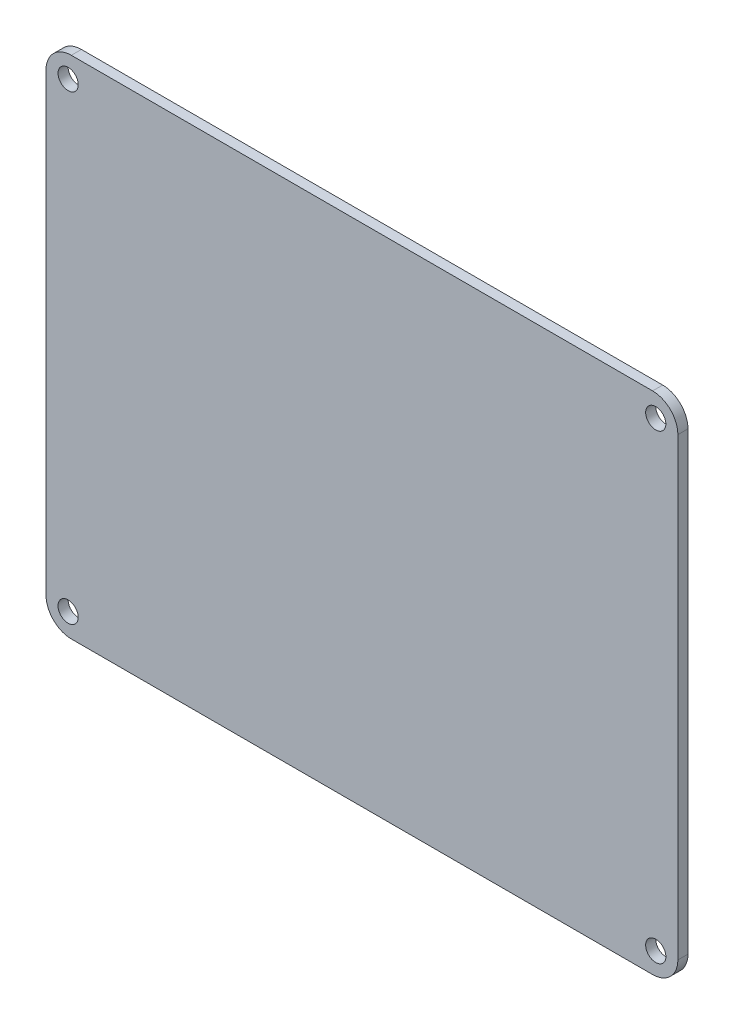
ISO-10303-21;
HEADER;
FILE_DESCRIPTION(('STEP AP214'),'2;1');
FILE_NAME('part.step','',(''),(''),'','','');
FILE_SCHEMA(('AUTOMOTIVE_DESIGN { 1 0 10303 214 1 1 1 1 }'));
ENDSEC;
DATA;
#1=APPLICATION_CONTEXT('core data for automotive mechanical design processes');
#2=APPLICATION_PROTOCOL_DEFINITION('international standard','automotive_design',2000,#1);
#3=PRODUCT_CONTEXT('',#1,'mechanical');
#4=PRODUCT('Part','Part','',(#3));
#5=PRODUCT_RELATED_PRODUCT_CATEGORY('part','',(#4));
#6=PRODUCT_DEFINITION_FORMATION('','',#4);
#7=PRODUCT_DEFINITION_CONTEXT('part definition',#1,'design');
#8=PRODUCT_DEFINITION('design','',#6,#7);
#9=PRODUCT_DEFINITION_SHAPE('','',#8);
#10=(LENGTH_UNIT() NAMED_UNIT(*) SI_UNIT(.MILLI.,.METRE.));
#11=(NAMED_UNIT(*) PLANE_ANGLE_UNIT() SI_UNIT($,.RADIAN.));
#12=(NAMED_UNIT(*) SI_UNIT($,.STERADIAN.) SOLID_ANGLE_UNIT());
#13=UNCERTAINTY_MEASURE_WITH_UNIT(LENGTH_MEASURE(1.E-05),#10,'distance_accuracy_value','');
#14=(GEOMETRIC_REPRESENTATION_CONTEXT(3) GLOBAL_UNCERTAINTY_ASSIGNED_CONTEXT((#13)) GLOBAL_UNIT_ASSIGNED_CONTEXT((#10,
#11,#12)) REPRESENTATION_CONTEXT('',''));
#15=CARTESIAN_POINT('',(0.,0.,0.));
#16=DIRECTION('',(0.,0.,1.));
#17=DIRECTION('',(1.,0.,0.));
#18=AXIS2_PLACEMENT_3D('',#15,#16,#17);
#19=CARTESIAN_POINT('',(-46.0000000000002,-35.9999999999997,1.6));
#20=DIRECTION('',(0.,0.,-1.));
#21=DIRECTION('',(-1.,0.,0.));
#22=AXIS2_PLACEMENT_3D('',#19,#20,#21);
#23=PLANE('',#22);
#24=CARTESIAN_POINT('',(-46.0000000000002,-35.9999999999997,1.6));
#25=DIRECTION('',(0.,0.,1.));
#26=DIRECTION('',(-1.,0.,0.));
#27=AXIS2_PLACEMENT_3D('',#24,#25,#26);
#28=CIRCLE('',#27,4.);
#29=CARTESIAN_POINT('',(-50.0000000000002,-35.9999999999997,1.6));
#30=VERTEX_POINT('',#29);
#31=CARTESIAN_POINT('',(-46.0000000000002,-39.9999999999997,1.6));
#32=VERTEX_POINT('',#31);
#33=EDGE_CURVE('E164',#30,#32,#28,.T.);
#34=ORIENTED_EDGE('',*,*,#33,.T.);
#35=DIRECTION('',(1.,0.,0.));
#36=VECTOR('',#35,1.);
#37=CARTESIAN_POINT('',(45.9999999999998,-39.9999999999997,1.6));
#38=LINE('',#37,#36);
#39=CARTESIAN_POINT('',(45.9999999999998,-39.9999999999997,1.6));
#40=VERTEX_POINT('',#39);
#41=EDGE_CURVE('E100',#32,#40,#38,.T.);
#42=ORIENTED_EDGE('',*,*,#41,.T.);
#43=CARTESIAN_POINT('',(45.9999999999998,-35.9999999999997,1.6));
#44=DIRECTION('',(0.,0.,1.));
#45=DIRECTION('',(1.,0.,0.));
#46=AXIS2_PLACEMENT_3D('',#43,#44,#45);
#47=CIRCLE('',#46,4.);
#48=CARTESIAN_POINT('',(49.9999999999998,-35.9999999999997,1.6));
#49=VERTEX_POINT('',#48);
#50=EDGE_CURVE('E185',#40,#49,#47,.T.);
#51=ORIENTED_EDGE('',*,*,#50,.T.);
#52=DIRECTION('',(0.,1.,0.));
#53=VECTOR('',#52,1.);
#54=CARTESIAN_POINT('',(49.9999999999998,-35.9999999999997,1.6));
#55=LINE('',#54,#53);
#56=CARTESIAN_POINT('',(49.9999999999998,36.0000000000001,1.6));
#57=VERTEX_POINT('',#56);
#58=EDGE_CURVE('E199',#49,#57,#55,.T.);
#59=ORIENTED_EDGE('',*,*,#58,.T.);
#60=CARTESIAN_POINT('',(45.9999999999998,36.0000000000001,1.6));
#61=DIRECTION('',(0.,0.,1.));
#62=DIRECTION('',(1.,0.,0.));
#63=AXIS2_PLACEMENT_3D('',#60,#61,#62);
#64=CIRCLE('',#63,4.);
#65=CARTESIAN_POINT('',(45.9999999999998,40.0000000000001,1.6));
#66=VERTEX_POINT('',#65);
#67=EDGE_CURVE('E119',#57,#66,#64,.T.);
#68=ORIENTED_EDGE('',*,*,#67,.T.);
#69=DIRECTION('',(-1.,0.,0.));
#70=VECTOR('',#69,1.);
#71=CARTESIAN_POINT('',(45.9999999999998,40.0000000000001,1.6));
#72=LINE('',#71,#70);
#73=CARTESIAN_POINT('',(-46.0000000000002,40.0000000000001,1.6));
#74=VERTEX_POINT('',#73);
#75=EDGE_CURVE('E113',#66,#74,#72,.T.);
#76=ORIENTED_EDGE('',*,*,#75,.T.);
#77=CARTESIAN_POINT('',(-46.0000000000002,36.0000000000001,1.6));
#78=DIRECTION('',(0.,0.,1.));
#79=DIRECTION('',(-1.,0.,0.));
#80=AXIS2_PLACEMENT_3D('',#77,#78,#79);
#81=CIRCLE('',#80,4.);
#82=CARTESIAN_POINT('',(-50.0000000000002,36.0000000000001,1.6));
#83=VERTEX_POINT('',#82);
#84=EDGE_CURVE('E117',#74,#83,#81,.T.);
#85=ORIENTED_EDGE('',*,*,#84,.T.);
#86=DIRECTION('',(0.,-1.,0.));
#87=VECTOR('',#86,1.);
#88=CARTESIAN_POINT('',(-50.0000000000002,-35.9999999999997,1.6));
#89=LINE('',#88,#87);
#90=EDGE_CURVE('E57',#83,#30,#89,.T.);
#91=ORIENTED_EDGE('',*,*,#90,.T.);
#92=EDGE_LOOP('',(#34,#42,#51,#59,#68,#76,#85,#91));
#93=FACE_BOUND('',#92,.T.);
#94=CARTESIAN_POINT('',(-46.5000000000002,36.5000000000001,1.6));
#95=DIRECTION('',(0.,0.,1.));
#96=DIRECTION('',(1.,0.,0.));
#97=AXIS2_PLACEMENT_3D('',#94,#95,#96);
#98=CIRCLE('',#97,1.6);
#99=CARTESIAN_POINT('',(-44.9000000000002,36.5000000000001,1.6));
#100=VERTEX_POINT('',#99);
#101=EDGE_CURVE('E146',#100,#100,#98,.T.);
#102=ORIENTED_EDGE('',*,*,#101,.F.);
#103=EDGE_LOOP('',(#102));
#104=FACE_BOUND('',#103,.T.);
#105=CARTESIAN_POINT('',(-46.5,-36.5,1.6));
#106=DIRECTION('',(0.,0.,1.));
#107=DIRECTION('',(1.,0.,0.));
#108=AXIS2_PLACEMENT_3D('',#105,#106,#107);
#109=CIRCLE('',#108,1.6);
#110=CARTESIAN_POINT('',(-44.9,-36.5,1.6));
#111=VERTEX_POINT('',#110);
#112=EDGE_CURVE('E213',#111,#111,#109,.T.);
#113=ORIENTED_EDGE('',*,*,#112,.F.);
#114=EDGE_LOOP('',(#113));
#115=FACE_BOUND('',#114,.T.);
#116=CARTESIAN_POINT('',(46.5,-36.5,1.6));
#117=DIRECTION('',(0.,0.,1.));
#118=DIRECTION('',(1.,0.,0.));
#119=AXIS2_PLACEMENT_3D('',#116,#117,#118);
#120=CIRCLE('',#119,1.6);
#121=CARTESIAN_POINT('',(48.1,-36.5,1.6));
#122=VERTEX_POINT('',#121);
#123=EDGE_CURVE('E221',#122,#122,#120,.T.);
#124=ORIENTED_EDGE('',*,*,#123,.F.);
#125=EDGE_LOOP('',(#124));
#126=FACE_BOUND('',#125,.T.);
#127=CARTESIAN_POINT('',(46.5,36.5,1.6));
#128=DIRECTION('',(0.,0.,1.));
#129=DIRECTION('',(1.,0.,0.));
#130=AXIS2_PLACEMENT_3D('',#127,#128,#129);
#131=CIRCLE('',#130,1.6);
#132=CARTESIAN_POINT('',(48.1,36.5,1.6));
#133=VERTEX_POINT('',#132);
#134=EDGE_CURVE('E229',#133,#133,#131,.T.);
#135=ORIENTED_EDGE('',*,*,#134,.F.);
#136=EDGE_LOOP('',(#135));
#137=FACE_BOUND('',#136,.T.);
#138=ADVANCED_FACE('F39',(#93,#104,#115,#126,#137),#23,.F.);
#139=CARTESIAN_POINT('',(-46.0000000000002,-35.9999999999997,0.));
#140=DIRECTION('',(0.,0.,-1.));
#141=DIRECTION('',(-1.,0.,0.));
#142=AXIS2_PLACEMENT_3D('',#139,#140,#141);
#143=PLANE('',#142);
#144=CARTESIAN_POINT('',(46.5,-36.5,0.));
#145=DIRECTION('',(0.,0.,1.));
#146=DIRECTION('',(1.,0.,0.));
#147=AXIS2_PLACEMENT_3D('',#144,#145,#146);
#148=CIRCLE('',#147,1.6);
#149=CARTESIAN_POINT('',(48.1,-36.5,0.));
#150=VERTEX_POINT('',#149);
#151=EDGE_CURVE('E225',#150,#150,#148,.T.);
#152=ORIENTED_EDGE('',*,*,#151,.T.);
#153=EDGE_LOOP('',(#152));
#154=FACE_BOUND('',#153,.T.);
#155=CARTESIAN_POINT('',(-46.5000000000002,36.5000000000001,0.));
#156=DIRECTION('',(0.,0.,1.));
#157=DIRECTION('',(1.,0.,0.));
#158=AXIS2_PLACEMENT_3D('',#155,#156,#157);
#159=CIRCLE('',#158,1.6);
#160=CARTESIAN_POINT('',(-44.9000000000002,36.5000000000001,0.));
#161=VERTEX_POINT('',#160);
#162=EDGE_CURVE('E209',#161,#161,#159,.T.);
#163=ORIENTED_EDGE('',*,*,#162,.T.);
#164=EDGE_LOOP('',(#163));
#165=FACE_BOUND('',#164,.T.);
#166=CARTESIAN_POINT('',(-46.0000000000002,-35.9999999999997,0.));
#167=DIRECTION('',(0.,0.,1.));
#168=DIRECTION('',(-1.,0.,0.));
#169=AXIS2_PLACEMENT_3D('',#166,#167,#168);
#170=CIRCLE('',#169,4.);
#171=CARTESIAN_POINT('',(-50.0000000000002,-35.9999999999997,0.));
#172=VERTEX_POINT('',#171);
#173=CARTESIAN_POINT('',(-46.0000000000002,-39.9999999999997,0.));
#174=VERTEX_POINT('',#173);
#175=EDGE_CURVE('E141',#172,#174,#170,.T.);
#176=ORIENTED_EDGE('',*,*,#175,.F.);
#177=DIRECTION('',(0.,-1.,0.));
#178=VECTOR('',#177,1.);
#179=CARTESIAN_POINT('',(-50.0000000000002,-35.9999999999997,0.));
#180=LINE('',#179,#178);
#181=CARTESIAN_POINT('',(-50.0000000000002,36.0000000000001,0.));
#182=VERTEX_POINT('',#181);
#183=EDGE_CURVE('E92',#182,#172,#180,.T.);
#184=ORIENTED_EDGE('',*,*,#183,.F.);
#185=CARTESIAN_POINT('',(-46.0000000000002,36.0000000000001,0.));
#186=DIRECTION('',(0.,0.,1.));
#187=DIRECTION('',(-1.,0.,0.));
#188=AXIS2_PLACEMENT_3D('',#185,#186,#187);
#189=CIRCLE('',#188,4.);
#190=CARTESIAN_POINT('',(-46.0000000000002,40.0000000000001,0.));
#191=VERTEX_POINT('',#190);
#192=EDGE_CURVE('E86',#191,#182,#189,.T.);
#193=ORIENTED_EDGE('',*,*,#192,.F.);
#194=DIRECTION('',(-1.,0.,0.));
#195=VECTOR('',#194,1.);
#196=CARTESIAN_POINT('',(45.9999999999998,40.0000000000001,0.));
#197=LINE('',#196,#195);
#198=CARTESIAN_POINT('',(45.9999999999998,40.0000000000001,0.));
#199=VERTEX_POINT('',#198);
#200=EDGE_CURVE('E128',#199,#191,#197,.T.);
#201=ORIENTED_EDGE('',*,*,#200,.F.);
#202=CARTESIAN_POINT('',(45.9999999999998,36.0000000000001,0.));
#203=DIRECTION('',(0.,0.,1.));
#204=DIRECTION('',(1.,0.,0.));
#205=AXIS2_PLACEMENT_3D('',#202,#203,#204);
#206=CIRCLE('',#205,4.);
#207=CARTESIAN_POINT('',(49.9999999999998,36.0000000000001,0.));
#208=VERTEX_POINT('',#207);
#209=EDGE_CURVE('E155',#208,#199,#206,.T.);
#210=ORIENTED_EDGE('',*,*,#209,.F.);
#211=DIRECTION('',(0.,1.,0.));
#212=VECTOR('',#211,1.);
#213=CARTESIAN_POINT('',(49.9999999999998,-35.9999999999997,0.));
#214=LINE('',#213,#212);
#215=CARTESIAN_POINT('',(49.9999999999998,-35.9999999999997,0.));
#216=VERTEX_POINT('',#215);
#217=EDGE_CURVE('E152',#216,#208,#214,.T.);
#218=ORIENTED_EDGE('',*,*,#217,.F.);
#219=CARTESIAN_POINT('',(45.9999999999998,-35.9999999999997,0.));
#220=DIRECTION('',(0.,0.,1.));
#221=DIRECTION('',(1.,0.,0.));
#222=AXIS2_PLACEMENT_3D('',#219,#220,#221);
#223=CIRCLE('',#222,4.);
#224=CARTESIAN_POINT('',(45.9999999999998,-39.9999999999997,0.));
#225=VERTEX_POINT('',#224);
#226=EDGE_CURVE('E149',#225,#216,#223,.T.);
#227=ORIENTED_EDGE('',*,*,#226,.F.);
#228=DIRECTION('',(1.,0.,0.));
#229=VECTOR('',#228,1.);
#230=CARTESIAN_POINT('',(45.9999999999998,-39.9999999999997,0.));
#231=LINE('',#230,#229);
#232=EDGE_CURVE('E145',#174,#225,#231,.T.);
#233=ORIENTED_EDGE('',*,*,#232,.F.);
#234=EDGE_LOOP('',(#176,#184,#193,#201,#210,#218,#227,#233));
#235=FACE_BOUND('',#234,.T.);
#236=CARTESIAN_POINT('',(-46.5,-36.5,0.));
#237=DIRECTION('',(0.,0.,1.));
#238=DIRECTION('',(1.,0.,0.));
#239=AXIS2_PLACEMENT_3D('',#236,#237,#238);
#240=CIRCLE('',#239,1.6);
#241=CARTESIAN_POINT('',(-44.9,-36.5,0.));
#242=VERTEX_POINT('',#241);
#243=EDGE_CURVE('E217',#242,#242,#240,.T.);
#244=ORIENTED_EDGE('',*,*,#243,.T.);
#245=EDGE_LOOP('',(#244));
#246=FACE_BOUND('',#245,.T.);
#247=CARTESIAN_POINT('',(46.5,36.5,0.));
#248=DIRECTION('',(0.,0.,1.));
#249=DIRECTION('',(1.,0.,0.));
#250=AXIS2_PLACEMENT_3D('',#247,#248,#249);
#251=CIRCLE('',#250,1.6);
#252=CARTESIAN_POINT('',(48.1,36.5,0.));
#253=VERTEX_POINT('',#252);
#254=EDGE_CURVE('E233',#253,#253,#251,.T.);
#255=ORIENTED_EDGE('',*,*,#254,.T.);
#256=EDGE_LOOP('',(#255));
#257=FACE_BOUND('',#256,.T.);
#258=ADVANCED_FACE('F189',(#154,#165,#235,#246,#257),#143,.T.);
#259=CARTESIAN_POINT('',(-46.0000000000002,-35.9999999999997,1.6));
#260=DIRECTION('',(0.,0.,-1.));
#261=DIRECTION('',(-1.,0.,0.));
#262=AXIS2_PLACEMENT_3D('',#259,#260,#261);
#263=CYLINDRICAL_SURFACE('',#262,4.);
#264=ORIENTED_EDGE('',*,*,#175,.T.);
#265=DIRECTION('',(0.,0.,-1.));
#266=VECTOR('',#265,1.);
#267=CARTESIAN_POINT('',(-46.0000000000002,-39.9999999999997,1.6));
#268=LINE('',#267,#266);
#269=EDGE_CURVE('E11',#32,#174,#268,.T.);
#270=ORIENTED_EDGE('',*,*,#269,.F.);
#271=ORIENTED_EDGE('',*,*,#33,.F.);
#272=DIRECTION('',(0.,0.,-1.));
#273=VECTOR('',#272,1.);
#274=CARTESIAN_POINT('',(-50.0000000000002,-35.9999999999997,1.6));
#275=LINE('',#274,#273);
#276=EDGE_CURVE('E137',#30,#172,#275,.T.);
#277=ORIENTED_EDGE('',*,*,#276,.T.);
#278=EDGE_LOOP('',(#264,#270,#271,#277));
#279=FACE_BOUND('',#278,.T.);
#280=ADVANCED_FACE('F41',(#279),#263,.T.);
#281=CARTESIAN_POINT('',(45.9999999999998,-39.9999999999997,1.6));
#282=DIRECTION('',(0.,1.,0.));
#283=DIRECTION('',(0.,0.,1.));
#284=AXIS2_PLACEMENT_3D('',#281,#282,#283);
#285=PLANE('',#284);
#286=ORIENTED_EDGE('',*,*,#232,.T.);
#287=DIRECTION('',(0.,0.,-1.));
#288=VECTOR('',#287,1.);
#289=CARTESIAN_POINT('',(45.9999999999998,-39.9999999999997,1.6));
#290=LINE('',#289,#288);
#291=EDGE_CURVE('E49',#40,#225,#290,.T.);
#292=ORIENTED_EDGE('',*,*,#291,.F.);
#293=ORIENTED_EDGE('',*,*,#41,.F.);
#294=ORIENTED_EDGE('',*,*,#269,.T.);
#295=EDGE_LOOP('',(#286,#292,#293,#294));
#296=FACE_BOUND('',#295,.T.);
#297=ADVANCED_FACE('F267',(#296),#285,.F.);
#298=CARTESIAN_POINT('',(45.9999999999998,-35.9999999999997,1.6));
#299=DIRECTION('',(0.,0.,-1.));
#300=DIRECTION('',(-1.,0.,0.));
#301=AXIS2_PLACEMENT_3D('',#298,#299,#300);
#302=CYLINDRICAL_SURFACE('',#301,4.);
#303=ORIENTED_EDGE('',*,*,#226,.T.);
#304=DIRECTION('',(0.,0.,-1.));
#305=VECTOR('',#304,1.);
#306=CARTESIAN_POINT('',(49.9999999999998,-35.9999999999997,1.6));
#307=LINE('',#306,#305);
#308=EDGE_CURVE('E175',#49,#216,#307,.T.);
#309=ORIENTED_EDGE('',*,*,#308,.F.);
#310=ORIENTED_EDGE('',*,*,#50,.F.);
#311=ORIENTED_EDGE('',*,*,#291,.T.);
#312=EDGE_LOOP('',(#303,#309,#310,#311));
#313=FACE_BOUND('',#312,.T.);
#314=ADVANCED_FACE('F183',(#313),#302,.T.);
#315=CARTESIAN_POINT('',(49.9999999999998,-35.9999999999997,1.6));
#316=DIRECTION('',(-1.,0.,0.));
#317=DIRECTION('',(0.,0.,1.));
#318=AXIS2_PLACEMENT_3D('',#315,#316,#317);
#319=PLANE('',#318);
#320=ORIENTED_EDGE('',*,*,#217,.T.);
#321=DIRECTION('',(0.,0.,-1.));
#322=VECTOR('',#321,1.);
#323=CARTESIAN_POINT('',(49.9999999999998,36.0000000000001,1.6));
#324=LINE('',#323,#322);
#325=EDGE_CURVE('E171',#57,#208,#324,.T.);
#326=ORIENTED_EDGE('',*,*,#325,.F.);
#327=ORIENTED_EDGE('',*,*,#58,.F.);
#328=ORIENTED_EDGE('',*,*,#308,.T.);
#329=EDGE_LOOP('',(#320,#326,#327,#328));
#330=FACE_BOUND('',#329,.T.);
#331=ADVANCED_FACE('F194',(#330),#319,.F.);
#332=CARTESIAN_POINT('',(45.9999999999998,36.0000000000001,1.6));
#333=DIRECTION('',(0.,0.,-1.));
#334=DIRECTION('',(-1.,0.,0.));
#335=AXIS2_PLACEMENT_3D('',#332,#333,#334);
#336=CYLINDRICAL_SURFACE('',#335,4.);
#337=ORIENTED_EDGE('',*,*,#209,.T.);
#338=DIRECTION('',(0.,0.,-1.));
#339=VECTOR('',#338,1.);
#340=CARTESIAN_POINT('',(45.9999999999998,40.0000000000001,1.6));
#341=LINE('',#340,#339);
#342=EDGE_CURVE('E130',#66,#199,#341,.T.);
#343=ORIENTED_EDGE('',*,*,#342,.F.);
#344=ORIENTED_EDGE('',*,*,#67,.F.);
#345=ORIENTED_EDGE('',*,*,#325,.T.);
#346=EDGE_LOOP('',(#337,#343,#344,#345));
#347=FACE_BOUND('',#346,.T.);
#348=ADVANCED_FACE('F197',(#347),#336,.T.);
#349=CARTESIAN_POINT('',(45.9999999999998,40.0000000000001,1.6));
#350=DIRECTION('',(0.,-1.,0.));
#351=DIRECTION('',(0.,0.,-1.));
#352=AXIS2_PLACEMENT_3D('',#349,#350,#351);
#353=PLANE('',#352);
#354=ORIENTED_EDGE('',*,*,#200,.T.);
#355=DIRECTION('',(0.,0.,-1.));
#356=VECTOR('',#355,1.);
#357=CARTESIAN_POINT('',(-46.0000000000002,40.0000000000001,1.6));
#358=LINE('',#357,#356);
#359=EDGE_CURVE('E125',#74,#191,#358,.T.);
#360=ORIENTED_EDGE('',*,*,#359,.F.);
#361=ORIENTED_EDGE('',*,*,#75,.F.);
#362=ORIENTED_EDGE('',*,*,#342,.T.);
#363=EDGE_LOOP('',(#354,#360,#361,#362));
#364=FACE_BOUND('',#363,.T.);
#365=ADVANCED_FACE('F126',(#364),#353,.F.);
#366=CARTESIAN_POINT('',(-46.0000000000002,36.0000000000001,1.6));
#367=DIRECTION('',(0.,0.,-1.));
#368=DIRECTION('',(-1.,0.,0.));
#369=AXIS2_PLACEMENT_3D('',#366,#367,#368);
#370=CYLINDRICAL_SURFACE('',#369,4.);
#371=ORIENTED_EDGE('',*,*,#192,.T.);
#372=DIRECTION('',(0.,0.,-1.));
#373=VECTOR('',#372,1.);
#374=CARTESIAN_POINT('',(-50.0000000000002,36.0000000000001,1.6));
#375=LINE('',#374,#373);
#376=EDGE_CURVE('E131',#83,#182,#375,.T.);
#377=ORIENTED_EDGE('',*,*,#376,.F.);
#378=ORIENTED_EDGE('',*,*,#84,.F.);
#379=ORIENTED_EDGE('',*,*,#359,.T.);
#380=EDGE_LOOP('',(#371,#377,#378,#379));
#381=FACE_BOUND('',#380,.T.);
#382=ADVANCED_FACE('F133',(#381),#370,.T.);
#383=CARTESIAN_POINT('',(-50.0000000000002,-35.9999999999997,1.6));
#384=DIRECTION('',(1.,0.,0.));
#385=DIRECTION('',(0.,0.,-1.));
#386=AXIS2_PLACEMENT_3D('',#383,#384,#385);
#387=PLANE('',#386);
#388=ORIENTED_EDGE('',*,*,#183,.T.);
#389=ORIENTED_EDGE('',*,*,#276,.F.);
#390=ORIENTED_EDGE('',*,*,#90,.F.);
#391=ORIENTED_EDGE('',*,*,#376,.T.);
#392=EDGE_LOOP('',(#388,#389,#390,#391));
#393=FACE_BOUND('',#392,.T.);
#394=ADVANCED_FACE('F255',(#393),#387,.F.);
#395=CARTESIAN_POINT('',(-46.5000000000002,36.5000000000001,1.6));
#396=DIRECTION('',(0.,0.,-1.));
#397=DIRECTION('',(-1.,0.,0.));
#398=AXIS2_PLACEMENT_3D('',#395,#396,#397);
#399=CYLINDRICAL_SURFACE('',#398,1.6);
#400=ORIENTED_EDGE('',*,*,#101,.T.);
#401=EDGE_LOOP('',(#400));
#402=FACE_BOUND('',#401,.T.);
#403=ORIENTED_EDGE('',*,*,#162,.F.);
#404=EDGE_LOOP('',(#403));
#405=FACE_BOUND('',#404,.T.);
#406=ADVANCED_FACE('F252',(#402,#405),#399,.F.);
#407=CARTESIAN_POINT('',(-46.5,-36.5,1.6));
#408=DIRECTION('',(0.,0.,-1.));
#409=DIRECTION('',(-1.,0.,0.));
#410=AXIS2_PLACEMENT_3D('',#407,#408,#409);
#411=CYLINDRICAL_SURFACE('',#410,1.6);
#412=ORIENTED_EDGE('',*,*,#112,.T.);
#413=EDGE_LOOP('',(#412));
#414=FACE_BOUND('',#413,.T.);
#415=ORIENTED_EDGE('',*,*,#243,.F.);
#416=EDGE_LOOP('',(#415));
#417=FACE_BOUND('',#416,.T.);
#418=ADVANCED_FACE('F331',(#414,#417),#411,.F.);
#419=CARTESIAN_POINT('',(46.5,-36.5,1.6));
#420=DIRECTION('',(0.,0.,-1.));
#421=DIRECTION('',(-1.,0.,0.));
#422=AXIS2_PLACEMENT_3D('',#419,#420,#421);
#423=CYLINDRICAL_SURFACE('',#422,1.6);
#424=ORIENTED_EDGE('',*,*,#123,.T.);
#425=EDGE_LOOP('',(#424));
#426=FACE_BOUND('',#425,.T.);
#427=ORIENTED_EDGE('',*,*,#151,.F.);
#428=EDGE_LOOP('',(#427));
#429=FACE_BOUND('',#428,.T.);
#430=ADVANCED_FACE('F339',(#426,#429),#423,.F.);
#431=CARTESIAN_POINT('',(46.5,36.5,1.6));
#432=DIRECTION('',(0.,0.,-1.));
#433=DIRECTION('',(-1.,0.,0.));
#434=AXIS2_PLACEMENT_3D('',#431,#432,#433);
#435=CYLINDRICAL_SURFACE('',#434,1.6);
#436=ORIENTED_EDGE('',*,*,#134,.T.);
#437=EDGE_LOOP('',(#436));
#438=FACE_BOUND('',#437,.T.);
#439=ORIENTED_EDGE('',*,*,#254,.F.);
#440=EDGE_LOOP('',(#439));
#441=FACE_BOUND('',#440,.T.);
#442=ADVANCED_FACE('F241',(#438,#441),#435,.F.);
#443=CLOSED_SHELL('',(#138,#258,#280,#297,#314,#331,#348,#365,#382,#394,#406,#418,#430,#442));
#444=MANIFOLD_SOLID_BREP('B2',#443);
#445=ADVANCED_BREP_SHAPE_REPRESENTATION('',(#18,#444),#14);
#446=SHAPE_DEFINITION_REPRESENTATION(#9,#445);
ENDSEC;
END-ISO-10303-21;
